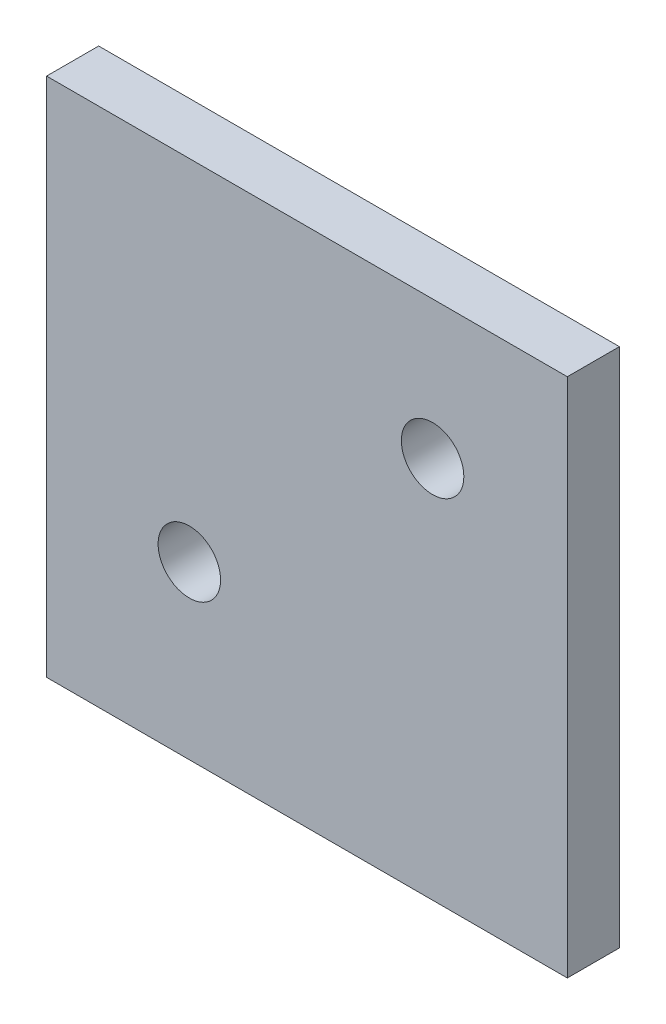
ISO-10303-21;
HEADER;
FILE_DESCRIPTION(('STEP AP214'),'2;1');
FILE_NAME('part.step','',(''),(''),'','','');
FILE_SCHEMA(('AUTOMOTIVE_DESIGN { 1 0 10303 214 1 1 1 1 }'));
ENDSEC;
DATA;
#1=APPLICATION_CONTEXT('core data for automotive mechanical design processes');
#2=APPLICATION_PROTOCOL_DEFINITION('international standard','automotive_design',2000,#1);
#3=PRODUCT_CONTEXT('',#1,'mechanical');
#4=PRODUCT('Part','Part','',(#3));
#5=PRODUCT_RELATED_PRODUCT_CATEGORY('part','',(#4));
#6=PRODUCT_DEFINITION_FORMATION('','',#4);
#7=PRODUCT_DEFINITION_CONTEXT('part definition',#1,'design');
#8=PRODUCT_DEFINITION('design','',#6,#7);
#9=PRODUCT_DEFINITION_SHAPE('','',#8);
#10=(LENGTH_UNIT() NAMED_UNIT(*) SI_UNIT(.MILLI.,.METRE.));
#11=(NAMED_UNIT(*) PLANE_ANGLE_UNIT() SI_UNIT($,.RADIAN.));
#12=(NAMED_UNIT(*) SI_UNIT($,.STERADIAN.) SOLID_ANGLE_UNIT());
#13=UNCERTAINTY_MEASURE_WITH_UNIT(LENGTH_MEASURE(1.E-05),#10,'distance_accuracy_value','');
#14=(GEOMETRIC_REPRESENTATION_CONTEXT(3) GLOBAL_UNCERTAINTY_ASSIGNED_CONTEXT((#13)) GLOBAL_UNIT_ASSIGNED_CONTEXT((#10,
#11,#12)) REPRESENTATION_CONTEXT('',''));
#15=CARTESIAN_POINT('',(0.,0.,0.));
#16=DIRECTION('',(0.,0.,1.));
#17=DIRECTION('',(1.,0.,0.));
#18=AXIS2_PLACEMENT_3D('',#15,#16,#17);
#19=CARTESIAN_POINT('',(-35.0378787878788,-62.1212121212121,10.));
#20=DIRECTION('',(1.,0.,0.));
#21=DIRECTION('',(0.,1.,0.));
#22=AXIS2_PLACEMENT_3D('',#19,#20,#21);
#23=PLANE('',#22);
#24=DIRECTION('',(0.,-1.,0.));
#25=VECTOR('',#24,1.);
#26=CARTESIAN_POINT('',(-35.0378787878788,-62.1212121212121,0.));
#27=LINE('',#26,#25);
#28=CARTESIAN_POINT('',(-35.0378787878788,37.8787878787879,0.));
#29=VERTEX_POINT('',#28);
#30=CARTESIAN_POINT('',(-35.0378787878788,-62.1212121212121,0.));
#31=VERTEX_POINT('',#30);
#32=EDGE_CURVE('E113',#29,#31,#27,.T.);
#33=ORIENTED_EDGE('',*,*,#32,.T.);
#34=DIRECTION('',(0.,0.,-1.));
#35=VECTOR('',#34,1.);
#36=CARTESIAN_POINT('',(-35.0378787878788,-62.1212121212121,10.));
#37=LINE('',#36,#35);
#38=CARTESIAN_POINT('',(-35.0378787878788,-62.1212121212121,10.));
#39=VERTEX_POINT('',#38);
#40=EDGE_CURVE('E11',#39,#31,#37,.T.);
#41=ORIENTED_EDGE('',*,*,#40,.F.);
#42=DIRECTION('',(0.,-1.,0.));
#43=VECTOR('',#42,1.);
#44=CARTESIAN_POINT('',(-35.0378787878788,-62.1212121212121,10.));
#45=LINE('',#44,#43);
#46=CARTESIAN_POINT('',(-35.0378787878788,37.8787878787879,10.));
#47=VERTEX_POINT('',#46);
#48=EDGE_CURVE('E97',#47,#39,#45,.T.);
#49=ORIENTED_EDGE('',*,*,#48,.F.);
#50=DIRECTION('',(0.,0.,-1.));
#51=VECTOR('',#50,1.);
#52=CARTESIAN_POINT('',(-35.0378787878788,37.8787878787879,10.));
#53=LINE('',#52,#51);
#54=EDGE_CURVE('E109',#47,#29,#53,.T.);
#55=ORIENTED_EDGE('',*,*,#54,.T.);
#56=EDGE_LOOP('',(#33,#41,#49,#55));
#57=FACE_BOUND('',#56,.T.);
#58=ADVANCED_FACE('F45',(#57),#23,.F.);
#59=CARTESIAN_POINT('',(64.9621212121212,-62.1212121212121,10.));
#60=DIRECTION('',(0.,1.,0.));
#61=DIRECTION('',(0.,0.,1.));
#62=AXIS2_PLACEMENT_3D('',#59,#60,#61);
#63=PLANE('',#62);
#64=DIRECTION('',(1.,0.,0.));
#65=VECTOR('',#64,1.);
#66=CARTESIAN_POINT('',(64.9621212121212,-62.1212121212121,0.));
#67=LINE('',#66,#65);
#68=CARTESIAN_POINT('',(64.9621212121212,-62.1212121212121,0.));
#69=VERTEX_POINT('',#68);
#70=EDGE_CURVE('E102',#31,#69,#67,.T.);
#71=ORIENTED_EDGE('',*,*,#70,.T.);
#72=DIRECTION('',(0.,0.,-1.));
#73=VECTOR('',#72,1.);
#74=CARTESIAN_POINT('',(64.9621212121212,-62.1212121212121,10.));
#75=LINE('',#74,#73);
#76=CARTESIAN_POINT('',(64.9621212121212,-62.1212121212121,10.));
#77=VERTEX_POINT('',#76);
#78=EDGE_CURVE('E54',#77,#69,#75,.T.);
#79=ORIENTED_EDGE('',*,*,#78,.F.);
#80=DIRECTION('',(1.,0.,0.));
#81=VECTOR('',#80,1.);
#82=CARTESIAN_POINT('',(64.9621212121212,-62.1212121212121,10.));
#83=LINE('',#82,#81);
#84=EDGE_CURVE('E92',#39,#77,#83,.T.);
#85=ORIENTED_EDGE('',*,*,#84,.F.);
#86=ORIENTED_EDGE('',*,*,#40,.T.);
#87=EDGE_LOOP('',(#71,#79,#85,#86));
#88=FACE_BOUND('',#87,.T.);
#89=ADVANCED_FACE('F101',(#88),#63,.F.);
#90=CARTESIAN_POINT('',(64.9621212121212,37.8787878787879,10.));
#91=DIRECTION('',(-1.,0.,0.));
#92=DIRECTION('',(0.,-1.,0.));
#93=AXIS2_PLACEMENT_3D('',#90,#91,#92);
#94=PLANE('',#93);
#95=DIRECTION('',(0.,1.,0.));
#96=VECTOR('',#95,1.);
#97=CARTESIAN_POINT('',(64.9621212121212,37.8787878787879,0.));
#98=LINE('',#97,#96);
#99=CARTESIAN_POINT('',(64.9621212121212,37.8787878787879,0.));
#100=VERTEX_POINT('',#99);
#101=EDGE_CURVE('E79',#69,#100,#98,.T.);
#102=ORIENTED_EDGE('',*,*,#101,.T.);
#103=DIRECTION('',(0.,0.,-1.));
#104=VECTOR('',#103,1.);
#105=CARTESIAN_POINT('',(64.9621212121212,37.8787878787879,10.));
#106=LINE('',#105,#104);
#107=CARTESIAN_POINT('',(64.9621212121212,37.8787878787879,10.));
#108=VERTEX_POINT('',#107);
#109=EDGE_CURVE('E104',#108,#100,#106,.T.);
#110=ORIENTED_EDGE('',*,*,#109,.F.);
#111=DIRECTION('',(0.,1.,0.));
#112=VECTOR('',#111,1.);
#113=CARTESIAN_POINT('',(64.9621212121212,37.8787878787879,10.));
#114=LINE('',#113,#112);
#115=EDGE_CURVE('E95',#77,#108,#114,.T.);
#116=ORIENTED_EDGE('',*,*,#115,.F.);
#117=ORIENTED_EDGE('',*,*,#78,.T.);
#118=EDGE_LOOP('',(#102,#110,#116,#117));
#119=FACE_BOUND('',#118,.T.);
#120=ADVANCED_FACE('F105',(#119),#94,.F.);
#121=CARTESIAN_POINT('',(-35.0378787878788,37.8787878787879,10.));
#122=DIRECTION('',(0.,-1.,0.));
#123=DIRECTION('',(0.,0.,-1.));
#124=AXIS2_PLACEMENT_3D('',#121,#122,#123);
#125=PLANE('',#124);
#126=DIRECTION('',(-1.,0.,0.));
#127=VECTOR('',#126,1.);
#128=CARTESIAN_POINT('',(-35.0378787878788,37.8787878787879,0.));
#129=LINE('',#128,#127);
#130=EDGE_CURVE('E85',#100,#29,#129,.T.);
#131=ORIENTED_EDGE('',*,*,#130,.T.);
#132=ORIENTED_EDGE('',*,*,#54,.F.);
#133=DIRECTION('',(-1.,0.,0.));
#134=VECTOR('',#133,1.);
#135=CARTESIAN_POINT('',(-35.0378787878788,37.8787878787879,10.));
#136=LINE('',#135,#134);
#137=EDGE_CURVE('E62',#108,#47,#136,.T.);
#138=ORIENTED_EDGE('',*,*,#137,.F.);
#139=ORIENTED_EDGE('',*,*,#109,.T.);
#140=EDGE_LOOP('',(#131,#132,#138,#139));
#141=FACE_BOUND('',#140,.T.);
#142=ADVANCED_FACE('F127',(#141),#125,.F.);
#143=CARTESIAN_POINT('',(0.,0.,10.));
#144=DIRECTION('',(0.,0.,-1.));
#145=DIRECTION('',(-1.,0.,0.));
#146=AXIS2_PLACEMENT_3D('',#143,#144,#145);
#147=PLANE('',#146);
#148=CARTESIAN_POINT('',(39.0874576211947,11.3313061409947,10.));
#149=DIRECTION('',(0.,0.,1.));
#150=DIRECTION('',(1.,0.,0.));
#151=AXIS2_PLACEMENT_3D('',#148,#149,#150);
#152=CIRCLE('',#151,6.);
#153=CARTESIAN_POINT('',(45.0874576211947,11.3313061409947,10.));
#154=VERTEX_POINT('',#153);
#155=EDGE_CURVE('E145',#154,#154,#152,.T.);
#156=ORIENTED_EDGE('',*,*,#155,.F.);
#157=EDGE_LOOP('',(#156));
#158=FACE_BOUND('',#157,.T.);
#159=CARTESIAN_POINT('',(-7.62534514697144,-29.2300164272482,10.));
#160=DIRECTION('',(0.,0.,1.));
#161=DIRECTION('',(1.,0.,0.));
#162=AXIS2_PLACEMENT_3D('',#159,#160,#161);
#163=CIRCLE('',#162,6.);
#164=CARTESIAN_POINT('',(-1.62534514697144,-29.2300164272482,10.));
#165=VERTEX_POINT('',#164);
#166=EDGE_CURVE('E137',#165,#165,#163,.T.);
#167=ORIENTED_EDGE('',*,*,#166,.F.);
#168=EDGE_LOOP('',(#167));
#169=FACE_BOUND('',#168,.T.);
#170=ORIENTED_EDGE('',*,*,#48,.T.);
#171=ORIENTED_EDGE('',*,*,#84,.T.);
#172=ORIENTED_EDGE('',*,*,#115,.T.);
#173=ORIENTED_EDGE('',*,*,#137,.T.);
#174=EDGE_LOOP('',(#170,#171,#172,#173));
#175=FACE_BOUND('',#174,.T.);
#176=ADVANCED_FACE('F93',(#158,#169,#175),#147,.F.);
#177=CARTESIAN_POINT('',(0.,0.,0.));
#178=DIRECTION('',(0.,0.,-1.));
#179=DIRECTION('',(-1.,0.,0.));
#180=AXIS2_PLACEMENT_3D('',#177,#178,#179);
#181=PLANE('',#180);
#182=CARTESIAN_POINT('',(39.0874576211947,11.3313061409947,0.));
#183=DIRECTION('',(0.,0.,1.));
#184=DIRECTION('',(1.,0.,0.));
#185=AXIS2_PLACEMENT_3D('',#182,#183,#184);
#186=CIRCLE('',#185,6.);
#187=CARTESIAN_POINT('',(45.0874576211947,11.3313061409947,0.));
#188=VERTEX_POINT('',#187);
#189=EDGE_CURVE('E141',#188,#188,#186,.T.);
#190=ORIENTED_EDGE('',*,*,#189,.T.);
#191=EDGE_LOOP('',(#190));
#192=FACE_BOUND('',#191,.T.);
#193=CARTESIAN_POINT('',(-7.62534514697144,-29.2300164272482,0.));
#194=DIRECTION('',(0.,0.,1.));
#195=DIRECTION('',(1.,0.,0.));
#196=AXIS2_PLACEMENT_3D('',#193,#194,#195);
#197=CIRCLE('',#196,6.);
#198=CARTESIAN_POINT('',(-1.62534514697144,-29.2300164272482,0.));
#199=VERTEX_POINT('',#198);
#200=EDGE_CURVE('E117',#199,#199,#197,.T.);
#201=ORIENTED_EDGE('',*,*,#200,.T.);
#202=EDGE_LOOP('',(#201));
#203=FACE_BOUND('',#202,.T.);
#204=ORIENTED_EDGE('',*,*,#32,.F.);
#205=ORIENTED_EDGE('',*,*,#130,.F.);
#206=ORIENTED_EDGE('',*,*,#101,.F.);
#207=ORIENTED_EDGE('',*,*,#70,.F.);
#208=EDGE_LOOP('',(#204,#205,#206,#207));
#209=FACE_BOUND('',#208,.T.);
#210=ADVANCED_FACE('F130',(#192,#203,#209),#181,.T.);
#211=CARTESIAN_POINT('',(-7.62534514697144,-29.2300164272482,10.));
#212=DIRECTION('',(0.,0.,1.));
#213=DIRECTION('',(1.,0.,0.));
#214=AXIS2_PLACEMENT_3D('',#211,#212,#213);
#215=CYLINDRICAL_SURFACE('',#214,6.);
#216=ORIENTED_EDGE('',*,*,#200,.F.);
#217=EDGE_LOOP('',(#216));
#218=FACE_BOUND('',#217,.T.);
#219=ORIENTED_EDGE('',*,*,#166,.T.);
#220=EDGE_LOOP('',(#219));
#221=FACE_BOUND('',#220,.T.);
#222=ADVANCED_FACE('F157',(#218,#221),#215,.F.);
#223=CARTESIAN_POINT('',(39.0874576211947,11.3313061409947,10.));
#224=DIRECTION('',(0.,0.,1.));
#225=DIRECTION('',(1.,0.,0.));
#226=AXIS2_PLACEMENT_3D('',#223,#224,#225);
#227=CYLINDRICAL_SURFACE('',#226,6.);
#228=ORIENTED_EDGE('',*,*,#189,.F.);
#229=EDGE_LOOP('',(#228));
#230=FACE_BOUND('',#229,.T.);
#231=ORIENTED_EDGE('',*,*,#155,.T.);
#232=EDGE_LOOP('',(#231));
#233=FACE_BOUND('',#232,.T.);
#234=ADVANCED_FACE('F150',(#230,#233),#227,.F.);
#235=CLOSED_SHELL('',(#58,#89,#120,#142,#176,#210,#222,#234));
#236=MANIFOLD_SOLID_BREP('B2',#235);
#237=ADVANCED_BREP_SHAPE_REPRESENTATION('',(#18,#236),#14);
#238=SHAPE_DEFINITION_REPRESENTATION(#9,#237);
ENDSEC;
END-ISO-10303-21;
